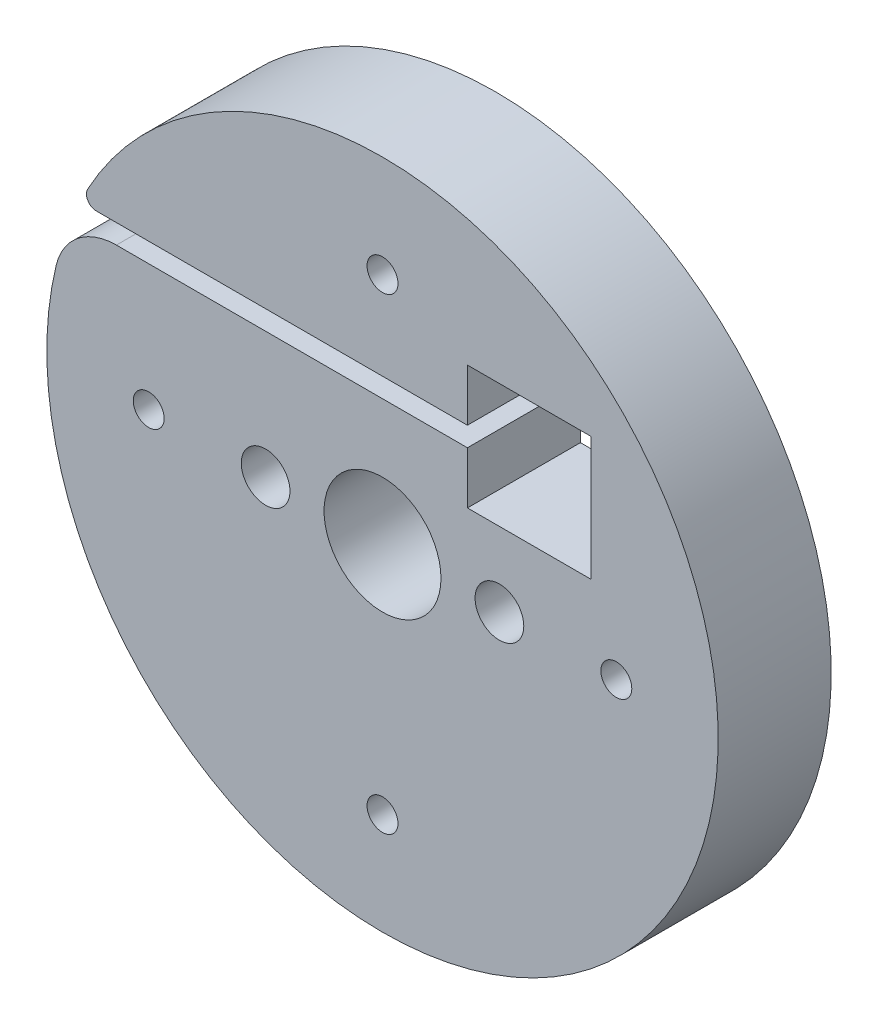
ISO-10303-21;
HEADER;
FILE_DESCRIPTION(('STEP AP214'),'2;1');
FILE_NAME('part.step','',(''),(''),'','','');
FILE_SCHEMA(('AUTOMOTIVE_DESIGN { 1 0 10303 214 1 1 1 1 }'));
ENDSEC;
DATA;
#1=APPLICATION_CONTEXT('core data for automotive mechanical design processes');
#2=APPLICATION_PROTOCOL_DEFINITION('international standard','automotive_design',2000,#1);
#3=PRODUCT_CONTEXT('',#1,'mechanical');
#4=PRODUCT('Part','Part','',(#3));
#5=PRODUCT_RELATED_PRODUCT_CATEGORY('part','',(#4));
#6=PRODUCT_DEFINITION_FORMATION('','',#4);
#7=PRODUCT_DEFINITION_CONTEXT('part definition',#1,'design');
#8=PRODUCT_DEFINITION('design','',#6,#7);
#9=PRODUCT_DEFINITION_SHAPE('','',#8);
#10=(LENGTH_UNIT() NAMED_UNIT(*) SI_UNIT(.MILLI.,.METRE.));
#11=(NAMED_UNIT(*) PLANE_ANGLE_UNIT() SI_UNIT($,.RADIAN.));
#12=(NAMED_UNIT(*) SI_UNIT($,.STERADIAN.) SOLID_ANGLE_UNIT());
#13=UNCERTAINTY_MEASURE_WITH_UNIT(LENGTH_MEASURE(1.E-05),#10,'distance_accuracy_value','');
#14=(GEOMETRIC_REPRESENTATION_CONTEXT(3) GLOBAL_UNCERTAINTY_ASSIGNED_CONTEXT((#13)) GLOBAL_UNIT_ASSIGNED_CONTEXT((#10,
#11,#12)) REPRESENTATION_CONTEXT('',''));
#15=CARTESIAN_POINT('',(0.,0.,0.));
#16=DIRECTION('',(0.,0.,1.));
#17=DIRECTION('',(1.,0.,0.));
#18=AXIS2_PLACEMENT_3D('',#15,#16,#17);
#19=CARTESIAN_POINT('',(0.,0.,5.8));
#20=DIRECTION('',(0.,0.,1.));
#21=DIRECTION('',(1.,0.,0.));
#22=AXIS2_PLACEMENT_3D('',#19,#20,#21);
#23=PLANE('',#22);
#24=CARTESIAN_POINT('',(-6.,0.,5.8));
#25=DIRECTION('',(0.,0.,1.));
#26=DIRECTION('',(1.,0.,0.));
#27=AXIS2_PLACEMENT_3D('',#24,#25,#26);
#28=CIRCLE('',#27,1.24999999999999);
#29=CARTESIAN_POINT('',(-4.75000000000001,0.,5.8));
#30=VERTEX_POINT('',#29);
#31=EDGE_CURVE('E235',#30,#30,#28,.T.);
#32=ORIENTED_EDGE('',*,*,#31,.F.);
#33=EDGE_LOOP('',(#32));
#34=FACE_BOUND('',#33,.T.);
#35=CARTESIAN_POINT('',(6.,0.,5.8));
#36=DIRECTION('',(0.,0.,1.));
#37=DIRECTION('',(1.,0.,0.));
#38=AXIS2_PLACEMENT_3D('',#35,#36,#37);
#39=CIRCLE('',#38,1.24999999999999);
#40=CARTESIAN_POINT('',(7.24999999999999,0.,5.8));
#41=VERTEX_POINT('',#40);
#42=EDGE_CURVE('E228',#41,#41,#39,.T.);
#43=ORIENTED_EDGE('',*,*,#42,.F.);
#44=EDGE_LOOP('',(#43));
#45=FACE_BOUND('',#44,.T.);
#46=CARTESIAN_POINT('',(0.,0.,5.8));
#47=DIRECTION('',(0.,0.,1.));
#48=DIRECTION('',(1.,0.,0.));
#49=AXIS2_PLACEMENT_3D('',#46,#47,#48);
#50=CIRCLE('',#49,17.2291666666667);
#51=CARTESIAN_POINT('',(-16.7445127253193,4.05776756596501,5.8));
#52=VERTEX_POINT('',#51);
#53=CARTESIAN_POINT('',(-15.1332496769079,8.23583257747167,5.8));
#54=VERTEX_POINT('',#53);
#55=EDGE_CURVE('E212',#52,#54,#50,.T.);
#56=ORIENTED_EDGE('',*,*,#55,.T.);
#57=CARTESIAN_POINT('',(-14.6870475485866,7.993,5.8));
#58=DIRECTION('',(0.,0.,1.));
#59=DIRECTION('',(1.,0.,0.));
#60=AXIS2_PLACEMENT_3D('',#57,#58,#59);
#61=CIRCLE('',#60,0.508);
#62=CARTESIAN_POINT('',(-14.6870475485866,7.485,5.8));
#63=VERTEX_POINT('',#62);
#64=EDGE_CURVE('E57',#54,#63,#61,.T.);
#65=ORIENTED_EDGE('',*,*,#64,.T.);
#66=DIRECTION('',(-1.,0.,0.));
#67=VECTOR('',#66,1.);
#68=CARTESIAN_POINT('',(-15.5183426636925,7.485,5.8));
#69=LINE('',#68,#67);
#70=CARTESIAN_POINT('',(4.35788989425966,7.485,5.8));
#71=VERTEX_POINT('',#70);
#72=EDGE_CURVE('E125',#71,#63,#69,.T.);
#73=ORIENTED_EDGE('',*,*,#72,.F.);
#74=DIRECTION('',(0.,-1.,0.));
#75=VECTOR('',#74,1.);
#76=CARTESIAN_POINT('',(4.35788989425966,7.485,5.8));
#77=LINE('',#76,#75);
#78=CARTESIAN_POINT('',(4.35788989425966,10.16,5.8));
#79=VERTEX_POINT('',#78);
#80=EDGE_CURVE('E168',#79,#71,#77,.T.);
#81=ORIENTED_EDGE('',*,*,#80,.F.);
#82=DIRECTION('',(-1.,0.,0.));
#83=VECTOR('',#82,1.);
#84=CARTESIAN_POINT('',(4.35788989425966,10.16,5.8));
#85=LINE('',#84,#83);
#86=CARTESIAN_POINT('',(10.7078898942597,10.16,5.8));
#87=VERTEX_POINT('',#86);
#88=EDGE_CURVE('E165',#87,#79,#85,.T.);
#89=ORIENTED_EDGE('',*,*,#88,.F.);
#90=DIRECTION('',(0.,1.,0.));
#91=VECTOR('',#90,1.);
#92=CARTESIAN_POINT('',(10.7078898942597,10.16,5.8));
#93=LINE('',#92,#91);
#94=CARTESIAN_POINT('',(10.7078898942597,3.81,5.8));
#95=VERTEX_POINT('',#94);
#96=EDGE_CURVE('E162',#95,#87,#93,.T.);
#97=ORIENTED_EDGE('',*,*,#96,.F.);
#98=DIRECTION('',(1.,0.,0.));
#99=VECTOR('',#98,1.);
#100=CARTESIAN_POINT('',(10.7078898942597,3.81,5.8));
#101=LINE('',#100,#99);
#102=CARTESIAN_POINT('',(4.35788989425966,3.81,5.8));
#103=VERTEX_POINT('',#102);
#104=EDGE_CURVE('E159',#103,#95,#101,.T.);
#105=ORIENTED_EDGE('',*,*,#104,.F.);
#106=DIRECTION('',(0.,-1.,0.));
#107=VECTOR('',#106,1.);
#108=CARTESIAN_POINT('',(4.35788989425966,3.81,5.8));
#109=LINE('',#108,#107);
#110=CARTESIAN_POINT('',(4.35788989425966,6.485,5.8));
#111=VERTEX_POINT('',#110);
#112=EDGE_CURVE('E156',#111,#103,#109,.T.);
#113=ORIENTED_EDGE('',*,*,#112,.F.);
#114=DIRECTION('',(1.,0.,0.));
#115=VECTOR('',#114,1.);
#116=CARTESIAN_POINT('',(4.35788989425966,6.485,5.8));
#117=LINE('',#116,#115);
#118=CARTESIAN_POINT('',(-13.6588250114878,6.485,5.8));
#119=VERTEX_POINT('',#118);
#120=EDGE_CURVE('E131',#119,#111,#117,.T.);
#121=ORIENTED_EDGE('',*,*,#120,.F.);
#122=CARTESIAN_POINT('',(-13.6588250114878,3.31,5.8));
#123=DIRECTION('',(0.,0.,1.));
#124=DIRECTION('',(1.,0.,0.));
#125=AXIS2_PLACEMENT_3D('',#122,#123,#124);
#126=CIRCLE('',#125,3.175);
#127=EDGE_CURVE('E218',#119,#52,#126,.T.);
#128=ORIENTED_EDGE('',*,*,#127,.T.);
#129=EDGE_LOOP('',(#56,#65,#73,#81,#89,#97,#105,#113,#121,#128));
#130=FACE_BOUND('',#129,.T.);
#131=CARTESIAN_POINT('',(-12.,0.,5.8));
#132=DIRECTION('',(0.,0.,1.));
#133=DIRECTION('',(1.,0.,0.));
#134=AXIS2_PLACEMENT_3D('',#131,#132,#133);
#135=CIRCLE('',#134,0.793749999999999);
#136=CARTESIAN_POINT('',(-11.20625,0.,5.8));
#137=VERTEX_POINT('',#136);
#138=EDGE_CURVE('E174',#137,#137,#135,.T.);
#139=ORIENTED_EDGE('',*,*,#138,.F.);
#140=EDGE_LOOP('',(#139));
#141=FACE_BOUND('',#140,.T.);
#142=CARTESIAN_POINT('',(0.,-12.,5.8));
#143=DIRECTION('',(0.,0.,1.));
#144=DIRECTION('',(1.,0.,0.));
#145=AXIS2_PLACEMENT_3D('',#142,#143,#144);
#146=CIRCLE('',#145,0.793749999999999);
#147=CARTESIAN_POINT('',(0.793750000000001,-12.,5.8));
#148=VERTEX_POINT('',#147);
#149=EDGE_CURVE('E185',#148,#148,#146,.T.);
#150=ORIENTED_EDGE('',*,*,#149,.F.);
#151=EDGE_LOOP('',(#150));
#152=FACE_BOUND('',#151,.T.);
#153=CARTESIAN_POINT('',(12.,0.,5.8));
#154=DIRECTION('',(0.,0.,1.));
#155=DIRECTION('',(1.,0.,0.));
#156=AXIS2_PLACEMENT_3D('',#153,#154,#155);
#157=CIRCLE('',#156,0.793749999999999);
#158=CARTESIAN_POINT('',(12.79375,0.,5.8));
#159=VERTEX_POINT('',#158);
#160=EDGE_CURVE('E191',#159,#159,#157,.T.);
#161=ORIENTED_EDGE('',*,*,#160,.F.);
#162=EDGE_LOOP('',(#161));
#163=FACE_BOUND('',#162,.T.);
#164=CARTESIAN_POINT('',(0.,12.,5.8));
#165=DIRECTION('',(0.,0.,1.));
#166=DIRECTION('',(1.,0.,0.));
#167=AXIS2_PLACEMENT_3D('',#164,#165,#166);
#168=CIRCLE('',#167,0.79375);
#169=CARTESIAN_POINT('',(0.79375,12.,5.8));
#170=VERTEX_POINT('',#169);
#171=EDGE_CURVE('E197',#170,#170,#168,.T.);
#172=ORIENTED_EDGE('',*,*,#171,.F.);
#173=EDGE_LOOP('',(#172));
#174=FACE_BOUND('',#173,.T.);
#175=CARTESIAN_POINT('',(0.,0.,5.8));
#176=DIRECTION('',(0.,0.,1.));
#177=DIRECTION('',(1.,0.,0.));
#178=AXIS2_PLACEMENT_3D('',#175,#176,#177);
#179=CIRCLE('',#178,3.);
#180=CARTESIAN_POINT('',(3.,0.,5.8));
#181=VERTEX_POINT('',#180);
#182=EDGE_CURVE('E206',#181,#181,#179,.T.);
#183=ORIENTED_EDGE('',*,*,#182,.F.);
#184=EDGE_LOOP('',(#183));
#185=FACE_BOUND('',#184,.T.);
#186=ADVANCED_FACE('F33',(#34,#45,#130,#141,#152,#163,#174,#185),#23,.T.);
#187=CARTESIAN_POINT('',(0.,0.,0.));
#188=DIRECTION('',(0.,0.,1.));
#189=DIRECTION('',(1.,0.,0.));
#190=AXIS2_PLACEMENT_3D('',#187,#188,#189);
#191=PLANE('',#190);
#192=CARTESIAN_POINT('',(-6.,0.,0.));
#193=DIRECTION('',(0.,0.,1.));
#194=DIRECTION('',(1.,0.,0.));
#195=AXIS2_PLACEMENT_3D('',#192,#193,#194);
#196=CIRCLE('',#195,1.24999999999999);
#197=CARTESIAN_POINT('',(-4.75000000000001,0.,0.));
#198=VERTEX_POINT('',#197);
#199=EDGE_CURVE('E37',#198,#198,#196,.T.);
#200=ORIENTED_EDGE('',*,*,#199,.T.);
#201=EDGE_LOOP('',(#200));
#202=FACE_BOUND('',#201,.T.);
#203=CARTESIAN_POINT('',(6.,0.,0.));
#204=DIRECTION('',(0.,0.,1.));
#205=DIRECTION('',(1.,0.,0.));
#206=AXIS2_PLACEMENT_3D('',#203,#204,#205);
#207=CIRCLE('',#206,1.24999999999999);
#208=CARTESIAN_POINT('',(7.24999999999999,0.,0.));
#209=VERTEX_POINT('',#208);
#210=EDGE_CURVE('E157',#209,#209,#207,.T.);
#211=ORIENTED_EDGE('',*,*,#210,.T.);
#212=EDGE_LOOP('',(#211));
#213=FACE_BOUND('',#212,.T.);
#214=CARTESIAN_POINT('',(-12.,0.,0.));
#215=DIRECTION('',(0.,0.,1.));
#216=DIRECTION('',(1.,0.,0.));
#217=AXIS2_PLACEMENT_3D('',#214,#215,#216);
#218=CIRCLE('',#217,0.793749999999999);
#219=CARTESIAN_POINT('',(-11.20625,0.,0.));
#220=VERTEX_POINT('',#219);
#221=EDGE_CURVE('E182',#220,#220,#218,.T.);
#222=ORIENTED_EDGE('',*,*,#221,.T.);
#223=EDGE_LOOP('',(#222));
#224=FACE_BOUND('',#223,.T.);
#225=CARTESIAN_POINT('',(0.,-12.,0.));
#226=DIRECTION('',(0.,0.,1.));
#227=DIRECTION('',(1.,0.,0.));
#228=AXIS2_PLACEMENT_3D('',#225,#226,#227);
#229=CIRCLE('',#228,0.793749999999999);
#230=CARTESIAN_POINT('',(0.793750000000001,-12.,0.));
#231=VERTEX_POINT('',#230);
#232=EDGE_CURVE('E188',#231,#231,#229,.T.);
#233=ORIENTED_EDGE('',*,*,#232,.T.);
#234=EDGE_LOOP('',(#233));
#235=FACE_BOUND('',#234,.T.);
#236=CARTESIAN_POINT('',(12.,0.,0.));
#237=DIRECTION('',(0.,0.,1.));
#238=DIRECTION('',(1.,0.,0.));
#239=AXIS2_PLACEMENT_3D('',#236,#237,#238);
#240=CIRCLE('',#239,0.793749999999999);
#241=CARTESIAN_POINT('',(12.79375,0.,0.));
#242=VERTEX_POINT('',#241);
#243=EDGE_CURVE('E194',#242,#242,#240,.T.);
#244=ORIENTED_EDGE('',*,*,#243,.T.);
#245=EDGE_LOOP('',(#244));
#246=FACE_BOUND('',#245,.T.);
#247=CARTESIAN_POINT('',(0.,12.,0.));
#248=DIRECTION('',(0.,0.,1.));
#249=DIRECTION('',(1.,0.,0.));
#250=AXIS2_PLACEMENT_3D('',#247,#248,#249);
#251=CIRCLE('',#250,0.79375);
#252=CARTESIAN_POINT('',(0.79375,12.,0.));
#253=VERTEX_POINT('',#252);
#254=EDGE_CURVE('E200',#253,#253,#251,.T.);
#255=ORIENTED_EDGE('',*,*,#254,.T.);
#256=EDGE_LOOP('',(#255));
#257=FACE_BOUND('',#256,.T.);
#258=DIRECTION('',(-1.,0.,0.));
#259=VECTOR('',#258,1.);
#260=CARTESIAN_POINT('',(-15.5183426636925,7.485,0.));
#261=LINE('',#260,#259);
#262=CARTESIAN_POINT('',(4.35788989425966,7.485,0.));
#263=VERTEX_POINT('',#262);
#264=CARTESIAN_POINT('',(-14.6870475485866,7.485,0.));
#265=VERTEX_POINT('',#264);
#266=EDGE_CURVE('E136',#263,#265,#261,.T.);
#267=ORIENTED_EDGE('',*,*,#266,.T.);
#268=CARTESIAN_POINT('',(-14.6870475485866,7.993,0.));
#269=DIRECTION('',(0.,0.,1.));
#270=DIRECTION('',(1.,0.,0.));
#271=AXIS2_PLACEMENT_3D('',#268,#269,#270);
#272=CIRCLE('',#271,0.508);
#273=CARTESIAN_POINT('',(-15.1332496769079,8.23583257747167,0.));
#274=VERTEX_POINT('',#273);
#275=EDGE_CURVE('E11',#265,#274,#272,.F.);
#276=ORIENTED_EDGE('',*,*,#275,.T.);
#277=CARTESIAN_POINT('',(0.,0.,0.));
#278=DIRECTION('',(0.,0.,1.));
#279=DIRECTION('',(1.,0.,0.));
#280=AXIS2_PLACEMENT_3D('',#277,#278,#279);
#281=CIRCLE('',#280,17.2291666666667);
#282=CARTESIAN_POINT('',(-16.7445127253193,4.05776756596501,0.));
#283=VERTEX_POINT('',#282);
#284=EDGE_CURVE('E209',#283,#274,#281,.T.);
#285=ORIENTED_EDGE('',*,*,#284,.F.);
#286=CARTESIAN_POINT('',(-13.6588250114878,3.31,0.));
#287=DIRECTION('',(0.,0.,1.));
#288=DIRECTION('',(1.,0.,0.));
#289=AXIS2_PLACEMENT_3D('',#286,#287,#288);
#290=CIRCLE('',#289,3.175);
#291=CARTESIAN_POINT('',(-13.6588250114878,6.485,0.));
#292=VERTEX_POINT('',#291);
#293=EDGE_CURVE('E121',#283,#292,#290,.F.);
#294=ORIENTED_EDGE('',*,*,#293,.T.);
#295=DIRECTION('',(1.,0.,0.));
#296=VECTOR('',#295,1.);
#297=CARTESIAN_POINT('',(4.35788989425966,6.485,0.));
#298=LINE('',#297,#296);
#299=CARTESIAN_POINT('',(4.35788989425966,6.485,0.));
#300=VERTEX_POINT('',#299);
#301=EDGE_CURVE('E112',#292,#300,#298,.T.);
#302=ORIENTED_EDGE('',*,*,#301,.T.);
#303=DIRECTION('',(0.,-1.,0.));
#304=VECTOR('',#303,1.);
#305=CARTESIAN_POINT('',(4.35788989425966,3.81,0.));
#306=LINE('',#305,#304);
#307=CARTESIAN_POINT('',(4.35788989425966,3.81,0.));
#308=VERTEX_POINT('',#307);
#309=EDGE_CURVE('E118',#300,#308,#306,.T.);
#310=ORIENTED_EDGE('',*,*,#309,.T.);
#311=DIRECTION('',(1.,0.,0.));
#312=VECTOR('',#311,1.);
#313=CARTESIAN_POINT('',(10.7078898942597,3.81,0.));
#314=LINE('',#313,#312);
#315=CARTESIAN_POINT('',(10.7078898942597,3.81,0.));
#316=VERTEX_POINT('',#315);
#317=EDGE_CURVE('E140',#308,#316,#314,.T.);
#318=ORIENTED_EDGE('',*,*,#317,.T.);
#319=DIRECTION('',(0.,1.,0.));
#320=VECTOR('',#319,1.);
#321=CARTESIAN_POINT('',(10.7078898942597,10.16,0.));
#322=LINE('',#321,#320);
#323=CARTESIAN_POINT('',(10.7078898942597,10.16,0.));
#324=VERTEX_POINT('',#323);
#325=EDGE_CURVE('E142',#316,#324,#322,.T.);
#326=ORIENTED_EDGE('',*,*,#325,.T.);
#327=DIRECTION('',(-1.,0.,0.));
#328=VECTOR('',#327,1.);
#329=CARTESIAN_POINT('',(4.35788989425966,10.16,0.));
#330=LINE('',#329,#328);
#331=CARTESIAN_POINT('',(4.35788989425966,10.16,0.));
#332=VERTEX_POINT('',#331);
#333=EDGE_CURVE('E148',#324,#332,#330,.T.);
#334=ORIENTED_EDGE('',*,*,#333,.T.);
#335=DIRECTION('',(0.,-1.,0.));
#336=VECTOR('',#335,1.);
#337=CARTESIAN_POINT('',(4.35788989425966,7.485,0.));
#338=LINE('',#337,#336);
#339=EDGE_CURVE('E151',#332,#263,#338,.T.);
#340=ORIENTED_EDGE('',*,*,#339,.T.);
#341=EDGE_LOOP('',(#267,#276,#285,#294,#302,#310,#318,#326,#334,#340));
#342=FACE_BOUND('',#341,.T.);
#343=CARTESIAN_POINT('',(0.,0.,0.));
#344=DIRECTION('',(0.,0.,1.));
#345=DIRECTION('',(1.,0.,0.));
#346=AXIS2_PLACEMENT_3D('',#343,#344,#345);
#347=CIRCLE('',#346,3.);
#348=CARTESIAN_POINT('',(3.,0.,0.));
#349=VERTEX_POINT('',#348);
#350=EDGE_CURVE('E203',#349,#349,#347,.T.);
#351=ORIENTED_EDGE('',*,*,#350,.T.);
#352=EDGE_LOOP('',(#351));
#353=FACE_BOUND('',#352,.T.);
#354=ADVANCED_FACE('F114',(#202,#213,#224,#235,#246,#257,#342,#353),#191,.F.);
#355=CARTESIAN_POINT('',(0.,0.,5.8));
#356=DIRECTION('',(0.,0.,-1.));
#357=DIRECTION('',(-1.,0.,0.));
#358=AXIS2_PLACEMENT_3D('',#355,#356,#357);
#359=CYLINDRICAL_SURFACE('',#358,17.2291666666667);
#360=ORIENTED_EDGE('',*,*,#284,.T.);
#361=DIRECTION('',(0.,0.,-1.));
#362=VECTOR('',#361,1.);
#363=CARTESIAN_POINT('',(-15.1332496769079,8.23583257747167,5.8));
#364=LINE('',#363,#362);
#365=EDGE_CURVE('E223',#274,#54,#364,.F.);
#366=ORIENTED_EDGE('',*,*,#365,.T.);
#367=ORIENTED_EDGE('',*,*,#55,.F.);
#368=DIRECTION('',(0.,0.,-1.));
#369=VECTOR('',#368,1.);
#370=CARTESIAN_POINT('',(-16.7445127253193,4.05776756596502,5.8));
#371=LINE('',#370,#369);
#372=EDGE_CURVE('E220',#52,#283,#371,.T.);
#373=ORIENTED_EDGE('',*,*,#372,.T.);
#374=EDGE_LOOP('',(#360,#366,#367,#373));
#375=FACE_BOUND('',#374,.T.);
#376=ADVANCED_FACE('F262',(#375),#359,.T.);
#377=CARTESIAN_POINT('',(0.,0.,5.8));
#378=DIRECTION('',(0.,0.,-1.));
#379=DIRECTION('',(-1.,0.,0.));
#380=AXIS2_PLACEMENT_3D('',#377,#378,#379);
#381=CYLINDRICAL_SURFACE('',#380,3.);
#382=ORIENTED_EDGE('',*,*,#182,.T.);
#383=EDGE_LOOP('',(#382));
#384=FACE_BOUND('',#383,.T.);
#385=ORIENTED_EDGE('',*,*,#350,.F.);
#386=EDGE_LOOP('',(#385));
#387=FACE_BOUND('',#386,.T.);
#388=ADVANCED_FACE('F258',(#384,#387),#381,.F.);
#389=CARTESIAN_POINT('',(0.,12.,0.));
#390=DIRECTION('',(0.,0.,1.));
#391=DIRECTION('',(1.,0.,0.));
#392=AXIS2_PLACEMENT_3D('',#389,#390,#391);
#393=CYLINDRICAL_SURFACE('',#392,0.79375);
#394=ORIENTED_EDGE('',*,*,#254,.F.);
#395=EDGE_LOOP('',(#394));
#396=FACE_BOUND('',#395,.T.);
#397=ORIENTED_EDGE('',*,*,#171,.T.);
#398=EDGE_LOOP('',(#397));
#399=FACE_BOUND('',#398,.T.);
#400=ADVANCED_FACE('F261',(#396,#399),#393,.F.);
#401=CARTESIAN_POINT('',(12.,0.,0.));
#402=DIRECTION('',(0.,0.,1.));
#403=DIRECTION('',(1.,0.,0.));
#404=AXIS2_PLACEMENT_3D('',#401,#402,#403);
#405=CYLINDRICAL_SURFACE('',#404,0.793749999999999);
#406=ORIENTED_EDGE('',*,*,#243,.F.);
#407=EDGE_LOOP('',(#406));
#408=FACE_BOUND('',#407,.T.);
#409=ORIENTED_EDGE('',*,*,#160,.T.);
#410=EDGE_LOOP('',(#409));
#411=FACE_BOUND('',#410,.T.);
#412=ADVANCED_FACE('F326',(#408,#411),#405,.F.);
#413=CARTESIAN_POINT('',(0.,-12.,0.));
#414=DIRECTION('',(0.,0.,1.));
#415=DIRECTION('',(1.,0.,0.));
#416=AXIS2_PLACEMENT_3D('',#413,#414,#415);
#417=CYLINDRICAL_SURFACE('',#416,0.793749999999999);
#418=ORIENTED_EDGE('',*,*,#232,.F.);
#419=EDGE_LOOP('',(#418));
#420=FACE_BOUND('',#419,.T.);
#421=ORIENTED_EDGE('',*,*,#149,.T.);
#422=EDGE_LOOP('',(#421));
#423=FACE_BOUND('',#422,.T.);
#424=ADVANCED_FACE('F310',(#420,#423),#417,.F.);
#425=CARTESIAN_POINT('',(-12.,0.,0.));
#426=DIRECTION('',(0.,0.,1.));
#427=DIRECTION('',(1.,0.,0.));
#428=AXIS2_PLACEMENT_3D('',#425,#426,#427);
#429=CYLINDRICAL_SURFACE('',#428,0.793749999999999);
#430=ORIENTED_EDGE('',*,*,#221,.F.);
#431=EDGE_LOOP('',(#430));
#432=FACE_BOUND('',#431,.T.);
#433=ORIENTED_EDGE('',*,*,#138,.T.);
#434=EDGE_LOOP('',(#433));
#435=FACE_BOUND('',#434,.T.);
#436=ADVANCED_FACE('F303',(#432,#435),#429,.F.);
#437=CARTESIAN_POINT('',(-15.5183426636925,7.485,0.));
#438=DIRECTION('',(0.,1.,0.));
#439=DIRECTION('',(-1.,0.,0.));
#440=AXIS2_PLACEMENT_3D('',#437,#438,#439);
#441=PLANE('',#440);
#442=ORIENTED_EDGE('',*,*,#72,.T.);
#443=DIRECTION('',(0.,0.,-1.));
#444=VECTOR('',#443,1.);
#445=CARTESIAN_POINT('',(-14.6870475485866,7.485,0.));
#446=LINE('',#445,#444);
#447=EDGE_CURVE('E42',#63,#265,#446,.T.);
#448=ORIENTED_EDGE('',*,*,#447,.T.);
#449=ORIENTED_EDGE('',*,*,#266,.F.);
#450=DIRECTION('',(0.,0.,1.));
#451=VECTOR('',#450,1.);
#452=CARTESIAN_POINT('',(4.35788989425966,7.485,0.));
#453=LINE('',#452,#451);
#454=EDGE_CURVE('E172',#263,#71,#453,.T.);
#455=ORIENTED_EDGE('',*,*,#454,.T.);
#456=EDGE_LOOP('',(#442,#448,#449,#455));
#457=FACE_BOUND('',#456,.T.);
#458=ADVANCED_FACE('F301',(#457),#441,.F.);
#459=CARTESIAN_POINT('',(4.35788989425966,7.485,0.));
#460=DIRECTION('',(-1.,0.,0.));
#461=DIRECTION('',(0.,0.,1.));
#462=AXIS2_PLACEMENT_3D('',#459,#460,#461);
#463=PLANE('',#462);
#464=ORIENTED_EDGE('',*,*,#80,.T.);
#465=ORIENTED_EDGE('',*,*,#454,.F.);
#466=ORIENTED_EDGE('',*,*,#339,.F.);
#467=DIRECTION('',(0.,0.,1.));
#468=VECTOR('',#467,1.);
#469=CARTESIAN_POINT('',(4.35788989425966,10.16,0.));
#470=LINE('',#469,#468);
#471=EDGE_CURVE('E175',#332,#79,#470,.T.);
#472=ORIENTED_EDGE('',*,*,#471,.T.);
#473=EDGE_LOOP('',(#464,#465,#466,#472));
#474=FACE_BOUND('',#473,.T.);
#475=ADVANCED_FACE('F298',(#474),#463,.F.);
#476=CARTESIAN_POINT('',(4.35788989425966,10.16,0.));
#477=DIRECTION('',(0.,1.,0.));
#478=DIRECTION('',(0.,0.,1.));
#479=AXIS2_PLACEMENT_3D('',#476,#477,#478);
#480=PLANE('',#479);
#481=ORIENTED_EDGE('',*,*,#88,.T.);
#482=ORIENTED_EDGE('',*,*,#471,.F.);
#483=ORIENTED_EDGE('',*,*,#333,.F.);
#484=DIRECTION('',(0.,0.,1.));
#485=VECTOR('',#484,1.);
#486=CARTESIAN_POINT('',(10.7078898942597,10.16,0.));
#487=LINE('',#486,#485);
#488=EDGE_CURVE('E177',#324,#87,#487,.T.);
#489=ORIENTED_EDGE('',*,*,#488,.T.);
#490=EDGE_LOOP('',(#481,#482,#483,#489));
#491=FACE_BOUND('',#490,.T.);
#492=ADVANCED_FACE('F294',(#491),#480,.F.);
#493=CARTESIAN_POINT('',(10.7078898942597,10.16,0.));
#494=DIRECTION('',(1.,0.,0.));
#495=DIRECTION('',(0.,1.,0.));
#496=AXIS2_PLACEMENT_3D('',#493,#494,#495);
#497=PLANE('',#496);
#498=ORIENTED_EDGE('',*,*,#96,.T.);
#499=ORIENTED_EDGE('',*,*,#488,.F.);
#500=ORIENTED_EDGE('',*,*,#325,.F.);
#501=DIRECTION('',(0.,0.,1.));
#502=VECTOR('',#501,1.);
#503=CARTESIAN_POINT('',(10.7078898942597,3.81,0.));
#504=LINE('',#503,#502);
#505=EDGE_CURVE('E179',#316,#95,#504,.T.);
#506=ORIENTED_EDGE('',*,*,#505,.T.);
#507=EDGE_LOOP('',(#498,#499,#500,#506));
#508=FACE_BOUND('',#507,.T.);
#509=ADVANCED_FACE('F292',(#508),#497,.F.);
#510=CARTESIAN_POINT('',(10.7078898942597,3.81,0.));
#511=DIRECTION('',(0.,-1.,0.));
#512=DIRECTION('',(1.,0.,0.));
#513=AXIS2_PLACEMENT_3D('',#510,#511,#512);
#514=PLANE('',#513);
#515=ORIENTED_EDGE('',*,*,#104,.T.);
#516=ORIENTED_EDGE('',*,*,#505,.F.);
#517=ORIENTED_EDGE('',*,*,#317,.F.);
#518=DIRECTION('',(0.,0.,1.));
#519=VECTOR('',#518,1.);
#520=CARTESIAN_POINT('',(4.35788989425966,3.81,0.));
#521=LINE('',#520,#519);
#522=EDGE_CURVE('E135',#308,#103,#521,.T.);
#523=ORIENTED_EDGE('',*,*,#522,.T.);
#524=EDGE_LOOP('',(#515,#516,#517,#523));
#525=FACE_BOUND('',#524,.T.);
#526=ADVANCED_FACE('F288',(#525),#514,.F.);
#527=CARTESIAN_POINT('',(4.35788989425966,3.81,0.));
#528=DIRECTION('',(-1.,0.,0.));
#529=DIRECTION('',(0.,0.,1.));
#530=AXIS2_PLACEMENT_3D('',#527,#528,#529);
#531=PLANE('',#530);
#532=ORIENTED_EDGE('',*,*,#112,.T.);
#533=ORIENTED_EDGE('',*,*,#522,.F.);
#534=ORIENTED_EDGE('',*,*,#309,.F.);
#535=DIRECTION('',(0.,0.,1.));
#536=VECTOR('',#535,1.);
#537=CARTESIAN_POINT('',(4.35788989425966,6.485,0.));
#538=LINE('',#537,#536);
#539=EDGE_CURVE('E128',#300,#111,#538,.T.);
#540=ORIENTED_EDGE('',*,*,#539,.T.);
#541=EDGE_LOOP('',(#532,#533,#534,#540));
#542=FACE_BOUND('',#541,.T.);
#543=ADVANCED_FACE('F138',(#542),#531,.F.);
#544=CARTESIAN_POINT('',(4.35788989425966,6.485,0.));
#545=DIRECTION('',(0.,-1.,0.));
#546=DIRECTION('',(1.,0.,0.));
#547=AXIS2_PLACEMENT_3D('',#544,#545,#546);
#548=PLANE('',#547);
#549=ORIENTED_EDGE('',*,*,#301,.F.);
#550=DIRECTION('',(0.,0.,-1.));
#551=VECTOR('',#550,1.);
#552=CARTESIAN_POINT('',(-13.6588250114878,6.485,0.));
#553=LINE('',#552,#551);
#554=EDGE_CURVE('E214',#292,#119,#553,.F.);
#555=ORIENTED_EDGE('',*,*,#554,.T.);
#556=ORIENTED_EDGE('',*,*,#120,.T.);
#557=ORIENTED_EDGE('',*,*,#539,.F.);
#558=EDGE_LOOP('',(#549,#555,#556,#557));
#559=FACE_BOUND('',#558,.T.);
#560=ADVANCED_FACE('F129',(#559),#548,.F.);
#561=CARTESIAN_POINT('',(-13.6588250114878,3.31,5.8));
#562=DIRECTION('',(0.,0.,-1.));
#563=DIRECTION('',(-1.,0.,0.));
#564=AXIS2_PLACEMENT_3D('',#561,#562,#563);
#565=CYLINDRICAL_SURFACE('',#564,3.175);
#566=ORIENTED_EDGE('',*,*,#293,.F.);
#567=ORIENTED_EDGE('',*,*,#372,.F.);
#568=ORIENTED_EDGE('',*,*,#127,.F.);
#569=ORIENTED_EDGE('',*,*,#554,.F.);
#570=EDGE_LOOP('',(#566,#567,#568,#569));
#571=FACE_BOUND('',#570,.T.);
#572=ADVANCED_FACE('F273',(#571),#565,.T.);
#573=CARTESIAN_POINT('',(-14.6870475485866,7.993,5.8));
#574=DIRECTION('',(0.,0.,-1.));
#575=DIRECTION('',(-1.,0.,0.));
#576=AXIS2_PLACEMENT_3D('',#573,#574,#575);
#577=CYLINDRICAL_SURFACE('',#576,0.508);
#578=ORIENTED_EDGE('',*,*,#275,.F.);
#579=ORIENTED_EDGE('',*,*,#447,.F.);
#580=ORIENTED_EDGE('',*,*,#64,.F.);
#581=ORIENTED_EDGE('',*,*,#365,.F.);
#582=EDGE_LOOP('',(#578,#579,#580,#581));
#583=FACE_BOUND('',#582,.T.);
#584=ADVANCED_FACE('F35',(#583),#577,.T.);
#585=CARTESIAN_POINT('',(6.,0.,5.8));
#586=DIRECTION('',(0.,0.,1.));
#587=DIRECTION('',(1.,0.,0.));
#588=AXIS2_PLACEMENT_3D('',#585,#586,#587);
#589=CYLINDRICAL_SURFACE('',#588,1.24999999999999);
#590=ORIENTED_EDGE('',*,*,#42,.T.);
#591=EDGE_LOOP('',(#590));
#592=FACE_BOUND('',#591,.T.);
#593=ORIENTED_EDGE('',*,*,#210,.F.);
#594=EDGE_LOOP('',(#593));
#595=FACE_BOUND('',#594,.T.);
#596=ADVANCED_FACE('F280',(#592,#595),#589,.F.);
#597=CARTESIAN_POINT('',(-6.,0.,5.8));
#598=DIRECTION('',(0.,0.,1.));
#599=DIRECTION('',(1.,0.,0.));
#600=AXIS2_PLACEMENT_3D('',#597,#598,#599);
#601=CYLINDRICAL_SURFACE('',#600,1.24999999999999);
#602=ORIENTED_EDGE('',*,*,#31,.T.);
#603=EDGE_LOOP('',(#602));
#604=FACE_BOUND('',#603,.T.);
#605=ORIENTED_EDGE('',*,*,#199,.F.);
#606=EDGE_LOOP('',(#605));
#607=FACE_BOUND('',#606,.T.);
#608=ADVANCED_FACE('F240',(#604,#607),#601,.F.);
#609=CLOSED_SHELL('',(#186,#354,#376,#388,#400,#412,#424,#436,#458,#475,#492,#509,#526,#543,
#560,#572,#584,#596,#608));
#610=MANIFOLD_SOLID_BREP('B2',#609);
#611=ADVANCED_BREP_SHAPE_REPRESENTATION('',(#18,#610),#14);
#612=SHAPE_DEFINITION_REPRESENTATION(#9,#611);
ENDSEC;
END-ISO-10303-21;
